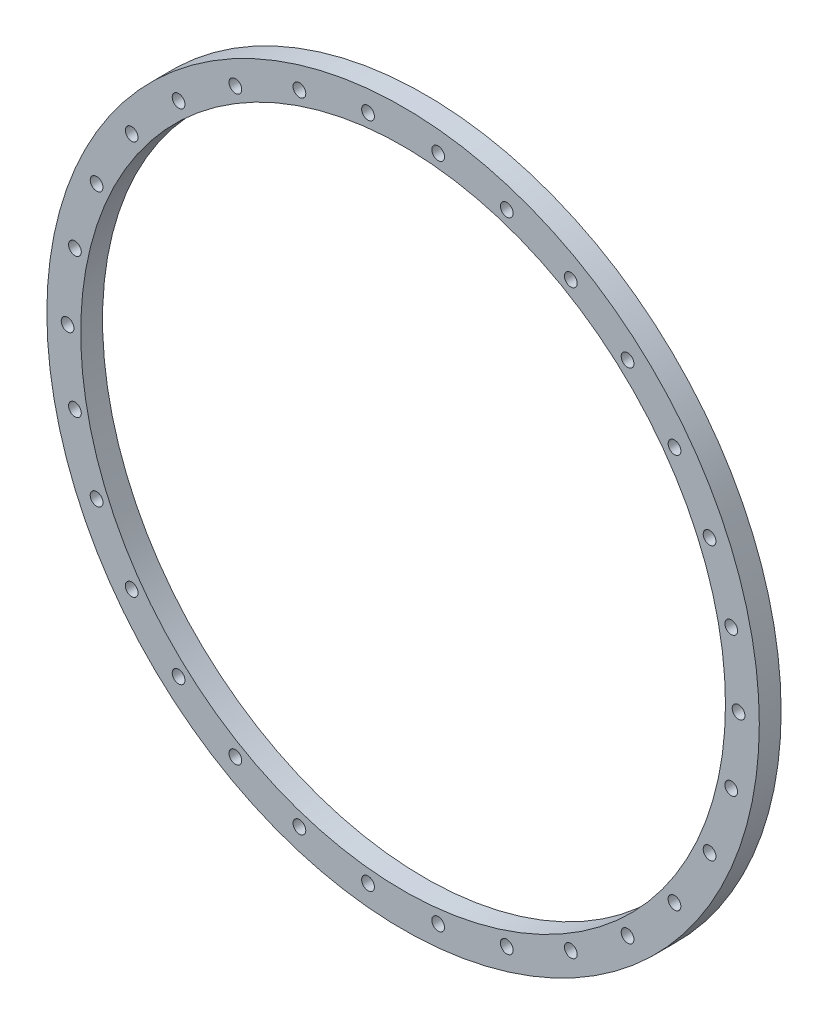
ISO-10303-21;
HEADER;
FILE_DESCRIPTION(('STEP AP214'),'2;1');
FILE_NAME('part.step','',(''),(''),'','','');
FILE_SCHEMA(('AUTOMOTIVE_DESIGN { 1 0 10303 214 1 1 1 1 }'));
ENDSEC;
DATA;
#1=APPLICATION_CONTEXT('core data for automotive mechanical design processes');
#2=APPLICATION_PROTOCOL_DEFINITION('international standard','automotive_design',2000,#1);
#3=PRODUCT_CONTEXT('',#1,'mechanical');
#4=PRODUCT('Part','Part','',(#3));
#5=PRODUCT_RELATED_PRODUCT_CATEGORY('part','',(#4));
#6=PRODUCT_DEFINITION_FORMATION('','',#4);
#7=PRODUCT_DEFINITION_CONTEXT('part definition',#1,'design');
#8=PRODUCT_DEFINITION('design','',#6,#7);
#9=PRODUCT_DEFINITION_SHAPE('','',#8);
#10=(LENGTH_UNIT() NAMED_UNIT(*) SI_UNIT(.MILLI.,.METRE.));
#11=(NAMED_UNIT(*) PLANE_ANGLE_UNIT() SI_UNIT($,.RADIAN.));
#12=(NAMED_UNIT(*) SI_UNIT($,.STERADIAN.) SOLID_ANGLE_UNIT());
#13=UNCERTAINTY_MEASURE_WITH_UNIT(LENGTH_MEASURE(1.E-05),#10,'distance_accuracy_value','');
#14=(GEOMETRIC_REPRESENTATION_CONTEXT(3) GLOBAL_UNCERTAINTY_ASSIGNED_CONTEXT((#13)) GLOBAL_UNIT_ASSIGNED_CONTEXT((#10,
#11,#12)) REPRESENTATION_CONTEXT('',''));
#15=CARTESIAN_POINT('',(0.,0.,0.));
#16=DIRECTION('',(0.,0.,1.));
#17=DIRECTION('',(1.,0.,0.));
#18=AXIS2_PLACEMENT_3D('',#15,#16,#17);
#19=CARTESIAN_POINT('',(0.,0.,30.));
#20=DIRECTION('',(0.,0.,1.));
#21=DIRECTION('',(1.,0.,0.));
#22=AXIS2_PLACEMENT_3D('',#19,#20,#21);
#23=PLANE('',#22);
#24=CARTESIAN_POINT('',(-421.144455973239,-187.505592457944,30.));
#25=DIRECTION('',(0.,0.,1.));
#26=DIRECTION('',(1.,0.,0.));
#27=AXIS2_PLACEMENT_3D('',#24,#25,#26);
#28=CIRCLE('',#27,8.75000000000002);
#29=CARTESIAN_POINT('',(-412.394455973239,-187.505592457944,30.));
#30=VERTEX_POINT('',#29);
#31=EDGE_CURVE('E215',#30,#30,#28,.T.);
#32=ORIENTED_EDGE('',*,*,#31,.F.);
#33=EDGE_LOOP('',(#32));
#34=FACE_BOUND('',#33,.T.);
#35=CARTESIAN_POINT('',(-308.469209531433,-342.589764545079,30.));
#36=DIRECTION('',(0.,0.,1.));
#37=DIRECTION('',(1.,0.,0.));
#38=AXIS2_PLACEMENT_3D('',#35,#36,#37);
#39=CIRCLE('',#38,8.74999999999997);
#40=CARTESIAN_POINT('',(-299.719209531433,-342.589764545079,30.));
#41=VERTEX_POINT('',#40);
#42=EDGE_CURVE('E203',#41,#41,#39,.T.);
#43=ORIENTED_EDGE('',*,*,#42,.F.);
#44=EDGE_LOOP('',(#43));
#45=FACE_BOUND('',#44,.T.);
#46=CARTESIAN_POINT('',(-142.456834406851,-438.437054012066,30.));
#47=DIRECTION('',(0.,0.,1.));
#48=DIRECTION('',(1.,0.,0.));
#49=AXIS2_PLACEMENT_3D('',#46,#47,#48);
#50=CIRCLE('',#49,8.7499999999999);
#51=CARTESIAN_POINT('',(-133.706834406851,-438.437054012066,30.));
#52=VERTEX_POINT('',#51);
#53=EDGE_CURVE('E191',#52,#52,#50,.T.);
#54=ORIENTED_EDGE('',*,*,#53,.F.);
#55=EDGE_LOOP('',(#54));
#56=FACE_BOUND('',#55,.T.);
#57=CARTESIAN_POINT('',(48.1876215663887,-458.474593764774,30.));
#58=DIRECTION('',(0.,0.,1.));
#59=DIRECTION('',(1.,0.,0.));
#60=AXIS2_PLACEMENT_3D('',#57,#58,#59);
#61=CIRCLE('',#60,8.74999999999999);
#62=CARTESIAN_POINT('',(56.9376215663886,-458.474593764774,30.));
#63=VERTEX_POINT('',#62);
#64=EDGE_CURVE('E179',#63,#63,#61,.T.);
#65=ORIENTED_EDGE('',*,*,#64,.F.);
#66=EDGE_LOOP('',(#65));
#67=FACE_BOUND('',#66,.T.);
#68=CARTESIAN_POINT('',(230.5,-399.237711144626,30.));
#69=DIRECTION('',(0.,0.,1.));
#70=DIRECTION('',(1.,0.,0.));
#71=AXIS2_PLACEMENT_3D('',#68,#69,#70);
#72=CIRCLE('',#71,8.7499999999999);
#73=CARTESIAN_POINT('',(239.25,-399.237711144626,30.));
#74=VERTEX_POINT('',#73);
#75=EDGE_CURVE('E167',#74,#74,#72,.T.);
#76=ORIENTED_EDGE('',*,*,#75,.F.);
#77=EDGE_LOOP('',(#76));
#78=FACE_BOUND('',#77,.T.);
#79=CARTESIAN_POINT('',(372.956834406851,-270.96900130683,30.));
#80=DIRECTION('',(0.,0.,1.));
#81=DIRECTION('',(1.,0.,0.));
#82=AXIS2_PLACEMENT_3D('',#79,#80,#81);
#83=CIRCLE('',#82,8.74999999999997);
#84=CARTESIAN_POINT('',(381.706834406851,-270.96900130683,30.));
#85=VERTEX_POINT('',#84);
#86=EDGE_CURVE('E155',#85,#85,#83,.T.);
#87=ORIENTED_EDGE('',*,*,#86,.F.);
#88=EDGE_LOOP('',(#87));
#89=FACE_BOUND('',#88,.T.);
#90=CARTESIAN_POINT('',(450.926043938284,-95.8472894669869,30.));
#91=DIRECTION('',(0.,0.,1.));
#92=DIRECTION('',(1.,0.,0.));
#93=AXIS2_PLACEMENT_3D('',#90,#91,#92);
#94=CIRCLE('',#93,8.74999999999997);
#95=CARTESIAN_POINT('',(459.676043938284,-95.8472894669869,30.));
#96=VERTEX_POINT('',#95);
#97=EDGE_CURVE('E143',#96,#96,#94,.T.);
#98=ORIENTED_EDGE('',*,*,#97,.F.);
#99=EDGE_LOOP('',(#98));
#100=FACE_BOUND('',#99,.T.);
#101=CARTESIAN_POINT('',(450.926043938284,95.8472894669873,30.));
#102=DIRECTION('',(0.,0.,1.));
#103=DIRECTION('',(1.,0.,0.));
#104=AXIS2_PLACEMENT_3D('',#101,#102,#103);
#105=CIRCLE('',#104,8.74999999999991);
#106=CARTESIAN_POINT('',(459.676043938284,95.8472894669873,30.));
#107=VERTEX_POINT('',#106);
#108=EDGE_CURVE('E131',#107,#107,#105,.T.);
#109=ORIENTED_EDGE('',*,*,#108,.F.);
#110=EDGE_LOOP('',(#109));
#111=FACE_BOUND('',#110,.T.);
#112=CARTESIAN_POINT('',(372.956834406851,270.96900130683,30.));
#113=DIRECTION('',(0.,0.,1.));
#114=DIRECTION('',(1.,0.,0.));
#115=AXIS2_PLACEMENT_3D('',#112,#113,#114);
#116=CIRCLE('',#115,8.74999999999997);
#117=CARTESIAN_POINT('',(381.706834406851,270.96900130683,30.));
#118=VERTEX_POINT('',#117);
#119=EDGE_CURVE('E119',#118,#118,#116,.T.);
#120=ORIENTED_EDGE('',*,*,#119,.F.);
#121=EDGE_LOOP('',(#120));
#122=FACE_BOUND('',#121,.T.);
#123=CARTESIAN_POINT('',(230.5,399.237711144626,30.));
#124=DIRECTION('',(0.,0.,1.));
#125=DIRECTION('',(1.,0.,0.));
#126=AXIS2_PLACEMENT_3D('',#123,#124,#125);
#127=CIRCLE('',#126,8.74999999999997);
#128=CARTESIAN_POINT('',(239.25,399.237711144626,30.));
#129=VERTEX_POINT('',#128);
#130=EDGE_CURVE('E107',#129,#129,#127,.T.);
#131=ORIENTED_EDGE('',*,*,#130,.F.);
#132=EDGE_LOOP('',(#131));
#133=FACE_BOUND('',#132,.T.);
#134=CARTESIAN_POINT('',(48.1876215663881,458.474593764774,30.));
#135=DIRECTION('',(0.,0.,1.));
#136=DIRECTION('',(1.,0.,0.));
#137=AXIS2_PLACEMENT_3D('',#134,#135,#136);
#138=CIRCLE('',#137,8.74999999999998);
#139=CARTESIAN_POINT('',(56.9376215663881,458.474593764774,30.));
#140=VERTEX_POINT('',#139);
#141=EDGE_CURVE('E95',#140,#140,#138,.T.);
#142=ORIENTED_EDGE('',*,*,#141,.F.);
#143=EDGE_LOOP('',(#142));
#144=FACE_BOUND('',#143,.T.);
#145=CARTESIAN_POINT('',(-142.456834406851,438.437054012066,30.));
#146=DIRECTION('',(0.,0.,1.));
#147=DIRECTION('',(1.,0.,0.));
#148=AXIS2_PLACEMENT_3D('',#145,#146,#147);
#149=CIRCLE('',#148,8.74999999999997);
#150=CARTESIAN_POINT('',(-133.706834406851,438.437054012066,30.));
#151=VERTEX_POINT('',#150);
#152=EDGE_CURVE('E83',#151,#151,#149,.T.);
#153=ORIENTED_EDGE('',*,*,#152,.F.);
#154=EDGE_LOOP('',(#153));
#155=FACE_BOUND('',#154,.T.);
#156=CARTESIAN_POINT('',(-308.469209531434,342.589764545079,30.));
#157=DIRECTION('',(0.,0.,1.));
#158=DIRECTION('',(1.,0.,0.));
#159=AXIS2_PLACEMENT_3D('',#156,#157,#158);
#160=CIRCLE('',#159,8.74999999999997);
#161=CARTESIAN_POINT('',(-299.719209531434,342.589764545079,30.));
#162=VERTEX_POINT('',#161);
#163=EDGE_CURVE('E71',#162,#162,#160,.T.);
#164=ORIENTED_EDGE('',*,*,#163,.F.);
#165=EDGE_LOOP('',(#164));
#166=FACE_BOUND('',#165,.T.);
#167=CARTESIAN_POINT('',(-421.144455973239,187.505592457944,30.));
#168=DIRECTION('',(0.,0.,1.));
#169=DIRECTION('',(1.,0.,0.));
#170=AXIS2_PLACEMENT_3D('',#167,#168,#169);
#171=CIRCLE('',#170,8.74999999999991);
#172=CARTESIAN_POINT('',(-412.394455973239,187.505592457944,30.));
#173=VERTEX_POINT('',#172);
#174=EDGE_CURVE('E59',#173,#173,#171,.T.);
#175=ORIENTED_EDGE('',*,*,#174,.F.);
#176=EDGE_LOOP('',(#175));
#177=FACE_BOUND('',#176,.T.);
#178=CARTESIAN_POINT('',(-461.,0.,30.));
#179=DIRECTION('',(0.,0.,1.));
#180=DIRECTION('',(1.,0.,0.));
#181=AXIS2_PLACEMENT_3D('',#178,#179,#180);
#182=CIRCLE('',#181,8.74999999999997);
#183=CARTESIAN_POINT('',(-452.25,0.,30.));
#184=VERTEX_POINT('',#183);
#185=EDGE_CURVE('E47',#184,#184,#182,.T.);
#186=ORIENTED_EDGE('',*,*,#185,.F.);
#187=EDGE_LOOP('',(#186));
#188=FACE_BOUND('',#187,.T.);
#189=CARTESIAN_POINT('',(0.,0.,30.));
#190=DIRECTION('',(0.,0.,1.));
#191=DIRECTION('',(1.,0.,0.));
#192=AXIS2_PLACEMENT_3D('',#189,#190,#191);
#193=CIRCLE('',#192,489.5);
#194=CARTESIAN_POINT('',(489.5,0.,30.));
#195=VERTEX_POINT('',#194);
#196=EDGE_CURVE('E10',#195,#195,#193,.T.);
#197=ORIENTED_EDGE('',*,*,#196,.T.);
#198=EDGE_LOOP('',(#197));
#199=FACE_BOUND('',#198,.T.);
#200=CARTESIAN_POINT('',(0.,0.,30.));
#201=DIRECTION('',(0.,0.,1.));
#202=DIRECTION('',(1.,0.,0.));
#203=AXIS2_PLACEMENT_3D('',#200,#201,#202);
#204=CIRCLE('',#203,443.);
#205=CARTESIAN_POINT('',(443.,0.,30.));
#206=VERTEX_POINT('',#205);
#207=EDGE_CURVE('E42',#206,#206,#204,.T.);
#208=ORIENTED_EDGE('',*,*,#207,.F.);
#209=EDGE_LOOP('',(#208));
#210=FACE_BOUND('',#209,.T.);
#211=CARTESIAN_POINT('',(-450.926043938284,95.8472894669871,30.));
#212=DIRECTION('',(0.,0.,1.));
#213=DIRECTION('',(1.,0.,0.));
#214=AXIS2_PLACEMENT_3D('',#211,#212,#213);
#215=CIRCLE('',#214,8.74999999999997);
#216=CARTESIAN_POINT('',(-442.176043938284,95.8472894669871,30.));
#217=VERTEX_POINT('',#216);
#218=EDGE_CURVE('E53',#217,#217,#215,.T.);
#219=ORIENTED_EDGE('',*,*,#218,.F.);
#220=EDGE_LOOP('',(#219));
#221=FACE_BOUND('',#220,.T.);
#222=CARTESIAN_POINT('',(-372.956834406851,270.96900130683,30.));
#223=DIRECTION('',(0.,0.,1.));
#224=DIRECTION('',(1.,0.,0.));
#225=AXIS2_PLACEMENT_3D('',#222,#223,#224);
#226=CIRCLE('',#225,8.75000000000008);
#227=CARTESIAN_POINT('',(-364.206834406851,270.96900130683,30.));
#228=VERTEX_POINT('',#227);
#229=EDGE_CURVE('E65',#228,#228,#226,.T.);
#230=ORIENTED_EDGE('',*,*,#229,.F.);
#231=EDGE_LOOP('',(#230));
#232=FACE_BOUND('',#231,.T.);
#233=CARTESIAN_POINT('',(-230.5,399.237711144626,30.));
#234=DIRECTION('',(0.,0.,1.));
#235=DIRECTION('',(1.,0.,0.));
#236=AXIS2_PLACEMENT_3D('',#233,#234,#235);
#237=CIRCLE('',#236,8.74999999999994);
#238=CARTESIAN_POINT('',(-221.75,399.237711144626,30.));
#239=VERTEX_POINT('',#238);
#240=EDGE_CURVE('E77',#239,#239,#237,.T.);
#241=ORIENTED_EDGE('',*,*,#240,.F.);
#242=EDGE_LOOP('',(#241));
#243=FACE_BOUND('',#242,.T.);
#244=CARTESIAN_POINT('',(-48.1876215663884,458.474593764774,30.));
#245=DIRECTION('',(0.,0.,1.));
#246=DIRECTION('',(1.,0.,0.));
#247=AXIS2_PLACEMENT_3D('',#244,#245,#246);
#248=CIRCLE('',#247,8.75000000000001);
#249=CARTESIAN_POINT('',(-39.4376215663884,458.474593764774,30.));
#250=VERTEX_POINT('',#249);
#251=EDGE_CURVE('E89',#250,#250,#248,.T.);
#252=ORIENTED_EDGE('',*,*,#251,.F.);
#253=EDGE_LOOP('',(#252));
#254=FACE_BOUND('',#253,.T.);
#255=CARTESIAN_POINT('',(142.456834406851,438.437054012066,30.));
#256=DIRECTION('',(0.,0.,1.));
#257=DIRECTION('',(1.,0.,0.));
#258=AXIS2_PLACEMENT_3D('',#255,#256,#257);
#259=CIRCLE('',#258,8.74999999999994);
#260=CARTESIAN_POINT('',(151.206834406851,438.437054012066,30.));
#261=VERTEX_POINT('',#260);
#262=EDGE_CURVE('E101',#261,#261,#259,.T.);
#263=ORIENTED_EDGE('',*,*,#262,.F.);
#264=EDGE_LOOP('',(#263));
#265=FACE_BOUND('',#264,.T.);
#266=CARTESIAN_POINT('',(308.469209531433,342.589764545079,30.));
#267=DIRECTION('',(0.,0.,1.));
#268=DIRECTION('',(1.,0.,0.));
#269=AXIS2_PLACEMENT_3D('',#266,#267,#268);
#270=CIRCLE('',#269,8.74999999999997);
#271=CARTESIAN_POINT('',(317.219209531433,342.589764545079,30.));
#272=VERTEX_POINT('',#271);
#273=EDGE_CURVE('E113',#272,#272,#270,.T.);
#274=ORIENTED_EDGE('',*,*,#273,.F.);
#275=EDGE_LOOP('',(#274));
#276=FACE_BOUND('',#275,.T.);
#277=CARTESIAN_POINT('',(421.144455973239,187.505592457944,30.));
#278=DIRECTION('',(0.,0.,1.));
#279=DIRECTION('',(1.,0.,0.));
#280=AXIS2_PLACEMENT_3D('',#277,#278,#279);
#281=CIRCLE('',#280,8.74999999999997);
#282=CARTESIAN_POINT('',(429.894455973239,187.505592457944,30.));
#283=VERTEX_POINT('',#282);
#284=EDGE_CURVE('E125',#283,#283,#281,.T.);
#285=ORIENTED_EDGE('',*,*,#284,.F.);
#286=EDGE_LOOP('',(#285));
#287=FACE_BOUND('',#286,.T.);
#288=CARTESIAN_POINT('',(461.,1.12912880000787E-13,30.));
#289=DIRECTION('',(0.,0.,1.));
#290=DIRECTION('',(1.,0.,0.));
#291=AXIS2_PLACEMENT_3D('',#288,#289,#290);
#292=CIRCLE('',#291,8.74999999999991);
#293=CARTESIAN_POINT('',(469.75,1.12912880000787E-13,30.));
#294=VERTEX_POINT('',#293);
#295=EDGE_CURVE('E137',#294,#294,#292,.T.);
#296=ORIENTED_EDGE('',*,*,#295,.F.);
#297=EDGE_LOOP('',(#296));
#298=FACE_BOUND('',#297,.T.);
#299=CARTESIAN_POINT('',(421.144455973239,-187.505592457944,30.));
#300=DIRECTION('',(0.,0.,1.));
#301=DIRECTION('',(1.,0.,0.));
#302=AXIS2_PLACEMENT_3D('',#299,#300,#301);
#303=CIRCLE('',#302,8.74999999999997);
#304=CARTESIAN_POINT('',(429.894455973239,-187.505592457944,30.));
#305=VERTEX_POINT('',#304);
#306=EDGE_CURVE('E149',#305,#305,#303,.T.);
#307=ORIENTED_EDGE('',*,*,#306,.F.);
#308=EDGE_LOOP('',(#307));
#309=FACE_BOUND('',#308,.T.);
#310=CARTESIAN_POINT('',(308.469209531434,-342.589764545079,30.));
#311=DIRECTION('',(0.,0.,1.));
#312=DIRECTION('',(1.,0.,0.));
#313=AXIS2_PLACEMENT_3D('',#310,#311,#312);
#314=CIRCLE('',#313,8.75000000000002);
#315=CARTESIAN_POINT('',(317.219209531434,-342.589764545079,30.));
#316=VERTEX_POINT('',#315);
#317=EDGE_CURVE('E161',#316,#316,#314,.T.);
#318=ORIENTED_EDGE('',*,*,#317,.F.);
#319=EDGE_LOOP('',(#318));
#320=FACE_BOUND('',#319,.T.);
#321=CARTESIAN_POINT('',(142.456834406851,-438.437054012066,30.));
#322=DIRECTION('',(0.,0.,1.));
#323=DIRECTION('',(1.,0.,0.));
#324=AXIS2_PLACEMENT_3D('',#321,#322,#323);
#325=CIRCLE('',#324,8.75);
#326=CARTESIAN_POINT('',(151.206834406851,-438.437054012066,30.));
#327=VERTEX_POINT('',#326);
#328=EDGE_CURVE('E173',#327,#327,#325,.T.);
#329=ORIENTED_EDGE('',*,*,#328,.F.);
#330=EDGE_LOOP('',(#329));
#331=FACE_BOUND('',#330,.T.);
#332=CARTESIAN_POINT('',(-48.187621566388,-458.474593764774,30.));
#333=DIRECTION('',(0.,0.,1.));
#334=DIRECTION('',(1.,0.,0.));
#335=AXIS2_PLACEMENT_3D('',#332,#333,#334);
#336=CIRCLE('',#335,8.74999999999997);
#337=CARTESIAN_POINT('',(-39.437621566388,-458.474593764774,30.));
#338=VERTEX_POINT('',#337);
#339=EDGE_CURVE('E185',#338,#338,#336,.T.);
#340=ORIENTED_EDGE('',*,*,#339,.F.);
#341=EDGE_LOOP('',(#340));
#342=FACE_BOUND('',#341,.T.);
#343=CARTESIAN_POINT('',(-230.5,-399.237711144626,30.));
#344=DIRECTION('',(0.,0.,1.));
#345=DIRECTION('',(1.,0.,0.));
#346=AXIS2_PLACEMENT_3D('',#343,#344,#345);
#347=CIRCLE('',#346,8.74999999999997);
#348=CARTESIAN_POINT('',(-221.75,-399.237711144626,30.));
#349=VERTEX_POINT('',#348);
#350=EDGE_CURVE('E197',#349,#349,#347,.T.);
#351=ORIENTED_EDGE('',*,*,#350,.F.);
#352=EDGE_LOOP('',(#351));
#353=FACE_BOUND('',#352,.T.);
#354=CARTESIAN_POINT('',(-372.956834406851,-270.96900130683,30.));
#355=DIRECTION('',(0.,0.,1.));
#356=DIRECTION('',(1.,0.,0.));
#357=AXIS2_PLACEMENT_3D('',#354,#355,#356);
#358=CIRCLE('',#357,8.74999999999997);
#359=CARTESIAN_POINT('',(-364.206834406851,-270.96900130683,30.));
#360=VERTEX_POINT('',#359);
#361=EDGE_CURVE('E209',#360,#360,#358,.T.);
#362=ORIENTED_EDGE('',*,*,#361,.F.);
#363=EDGE_LOOP('',(#362));
#364=FACE_BOUND('',#363,.T.);
#365=CARTESIAN_POINT('',(-450.926043938284,-95.8472894669873,30.));
#366=DIRECTION('',(0.,0.,1.));
#367=DIRECTION('',(1.,0.,0.));
#368=AXIS2_PLACEMENT_3D('',#365,#366,#367);
#369=CIRCLE('',#368,8.74999999999997);
#370=CARTESIAN_POINT('',(-442.176043938284,-95.8472894669873,30.));
#371=VERTEX_POINT('',#370);
#372=EDGE_CURVE('E221',#371,#371,#369,.T.);
#373=ORIENTED_EDGE('',*,*,#372,.F.);
#374=EDGE_LOOP('',(#373));
#375=FACE_BOUND('',#374,.T.);
#376=ADVANCED_FACE('F31',(#34,#45,#56,#67,#78,#89,#100,#111,#122,#133,#144,#155,#166,#177,#188,
#199,#210,#221,#232,#243,#254,#265,#276,#287,#298,#309,#320,#331,#342,#353,#364,#375),#23,.T.);
#377=CARTESIAN_POINT('',(0.,0.,0.));
#378=DIRECTION('',(0.,0.,1.));
#379=DIRECTION('',(1.,0.,0.));
#380=AXIS2_PLACEMENT_3D('',#377,#378,#379);
#381=PLANE('',#380);
#382=CARTESIAN_POINT('',(-421.144455973239,-187.505592457944,0.));
#383=DIRECTION('',(0.,0.,1.));
#384=DIRECTION('',(1.,0.,0.));
#385=AXIS2_PLACEMENT_3D('',#382,#383,#384);
#386=CIRCLE('',#385,8.75000000000002);
#387=CARTESIAN_POINT('',(-412.394455973239,-187.505592457944,0.));
#388=VERTEX_POINT('',#387);
#389=EDGE_CURVE('E218',#388,#388,#386,.T.);
#390=ORIENTED_EDGE('',*,*,#389,.T.);
#391=EDGE_LOOP('',(#390));
#392=FACE_BOUND('',#391,.T.);
#393=CARTESIAN_POINT('',(-308.469209531433,-342.589764545079,0.));
#394=DIRECTION('',(0.,0.,1.));
#395=DIRECTION('',(1.,0.,0.));
#396=AXIS2_PLACEMENT_3D('',#393,#394,#395);
#397=CIRCLE('',#396,8.74999999999997);
#398=CARTESIAN_POINT('',(-299.719209531433,-342.589764545079,0.));
#399=VERTEX_POINT('',#398);
#400=EDGE_CURVE('E206',#399,#399,#397,.T.);
#401=ORIENTED_EDGE('',*,*,#400,.T.);
#402=EDGE_LOOP('',(#401));
#403=FACE_BOUND('',#402,.T.);
#404=CARTESIAN_POINT('',(-142.456834406851,-438.437054012066,0.));
#405=DIRECTION('',(0.,0.,1.));
#406=DIRECTION('',(1.,0.,0.));
#407=AXIS2_PLACEMENT_3D('',#404,#405,#406);
#408=CIRCLE('',#407,8.7499999999999);
#409=CARTESIAN_POINT('',(-133.706834406851,-438.437054012066,0.));
#410=VERTEX_POINT('',#409);
#411=EDGE_CURVE('E194',#410,#410,#408,.T.);
#412=ORIENTED_EDGE('',*,*,#411,.T.);
#413=EDGE_LOOP('',(#412));
#414=FACE_BOUND('',#413,.T.);
#415=CARTESIAN_POINT('',(48.1876215663887,-458.474593764774,0.));
#416=DIRECTION('',(0.,0.,1.));
#417=DIRECTION('',(1.,0.,0.));
#418=AXIS2_PLACEMENT_3D('',#415,#416,#417);
#419=CIRCLE('',#418,8.74999999999999);
#420=CARTESIAN_POINT('',(56.9376215663886,-458.474593764774,0.));
#421=VERTEX_POINT('',#420);
#422=EDGE_CURVE('E182',#421,#421,#419,.T.);
#423=ORIENTED_EDGE('',*,*,#422,.T.);
#424=EDGE_LOOP('',(#423));
#425=FACE_BOUND('',#424,.T.);
#426=CARTESIAN_POINT('',(230.5,-399.237711144626,0.));
#427=DIRECTION('',(0.,0.,1.));
#428=DIRECTION('',(1.,0.,0.));
#429=AXIS2_PLACEMENT_3D('',#426,#427,#428);
#430=CIRCLE('',#429,8.7499999999999);
#431=CARTESIAN_POINT('',(239.25,-399.237711144626,0.));
#432=VERTEX_POINT('',#431);
#433=EDGE_CURVE('E170',#432,#432,#430,.T.);
#434=ORIENTED_EDGE('',*,*,#433,.T.);
#435=EDGE_LOOP('',(#434));
#436=FACE_BOUND('',#435,.T.);
#437=CARTESIAN_POINT('',(372.956834406851,-270.96900130683,0.));
#438=DIRECTION('',(0.,0.,1.));
#439=DIRECTION('',(1.,0.,0.));
#440=AXIS2_PLACEMENT_3D('',#437,#438,#439);
#441=CIRCLE('',#440,8.74999999999997);
#442=CARTESIAN_POINT('',(381.706834406851,-270.96900130683,0.));
#443=VERTEX_POINT('',#442);
#444=EDGE_CURVE('E158',#443,#443,#441,.T.);
#445=ORIENTED_EDGE('',*,*,#444,.T.);
#446=EDGE_LOOP('',(#445));
#447=FACE_BOUND('',#446,.T.);
#448=CARTESIAN_POINT('',(450.926043938284,-95.8472894669869,0.));
#449=DIRECTION('',(0.,0.,1.));
#450=DIRECTION('',(1.,0.,0.));
#451=AXIS2_PLACEMENT_3D('',#448,#449,#450);
#452=CIRCLE('',#451,8.74999999999997);
#453=CARTESIAN_POINT('',(459.676043938284,-95.8472894669869,0.));
#454=VERTEX_POINT('',#453);
#455=EDGE_CURVE('E146',#454,#454,#452,.T.);
#456=ORIENTED_EDGE('',*,*,#455,.T.);
#457=EDGE_LOOP('',(#456));
#458=FACE_BOUND('',#457,.T.);
#459=CARTESIAN_POINT('',(450.926043938284,95.8472894669873,0.));
#460=DIRECTION('',(0.,0.,1.));
#461=DIRECTION('',(1.,0.,0.));
#462=AXIS2_PLACEMENT_3D('',#459,#460,#461);
#463=CIRCLE('',#462,8.74999999999991);
#464=CARTESIAN_POINT('',(459.676043938284,95.8472894669873,0.));
#465=VERTEX_POINT('',#464);
#466=EDGE_CURVE('E134',#465,#465,#463,.T.);
#467=ORIENTED_EDGE('',*,*,#466,.T.);
#468=EDGE_LOOP('',(#467));
#469=FACE_BOUND('',#468,.T.);
#470=CARTESIAN_POINT('',(372.956834406851,270.96900130683,0.));
#471=DIRECTION('',(0.,0.,1.));
#472=DIRECTION('',(1.,0.,0.));
#473=AXIS2_PLACEMENT_3D('',#470,#471,#472);
#474=CIRCLE('',#473,8.74999999999997);
#475=CARTESIAN_POINT('',(381.706834406851,270.96900130683,0.));
#476=VERTEX_POINT('',#475);
#477=EDGE_CURVE('E122',#476,#476,#474,.T.);
#478=ORIENTED_EDGE('',*,*,#477,.T.);
#479=EDGE_LOOP('',(#478));
#480=FACE_BOUND('',#479,.T.);
#481=CARTESIAN_POINT('',(230.5,399.237711144626,0.));
#482=DIRECTION('',(0.,0.,1.));
#483=DIRECTION('',(1.,0.,0.));
#484=AXIS2_PLACEMENT_3D('',#481,#482,#483);
#485=CIRCLE('',#484,8.74999999999997);
#486=CARTESIAN_POINT('',(239.25,399.237711144626,0.));
#487=VERTEX_POINT('',#486);
#488=EDGE_CURVE('E110',#487,#487,#485,.T.);
#489=ORIENTED_EDGE('',*,*,#488,.T.);
#490=EDGE_LOOP('',(#489));
#491=FACE_BOUND('',#490,.T.);
#492=CARTESIAN_POINT('',(48.1876215663881,458.474593764774,0.));
#493=DIRECTION('',(0.,0.,1.));
#494=DIRECTION('',(1.,0.,0.));
#495=AXIS2_PLACEMENT_3D('',#492,#493,#494);
#496=CIRCLE('',#495,8.74999999999998);
#497=CARTESIAN_POINT('',(56.9376215663881,458.474593764774,0.));
#498=VERTEX_POINT('',#497);
#499=EDGE_CURVE('E98',#498,#498,#496,.T.);
#500=ORIENTED_EDGE('',*,*,#499,.T.);
#501=EDGE_LOOP('',(#500));
#502=FACE_BOUND('',#501,.T.);
#503=CARTESIAN_POINT('',(-142.456834406851,438.437054012066,0.));
#504=DIRECTION('',(0.,0.,1.));
#505=DIRECTION('',(1.,0.,0.));
#506=AXIS2_PLACEMENT_3D('',#503,#504,#505);
#507=CIRCLE('',#506,8.74999999999997);
#508=CARTESIAN_POINT('',(-133.706834406851,438.437054012066,0.));
#509=VERTEX_POINT('',#508);
#510=EDGE_CURVE('E86',#509,#509,#507,.T.);
#511=ORIENTED_EDGE('',*,*,#510,.T.);
#512=EDGE_LOOP('',(#511));
#513=FACE_BOUND('',#512,.T.);
#514=CARTESIAN_POINT('',(-308.469209531434,342.589764545079,0.));
#515=DIRECTION('',(0.,0.,1.));
#516=DIRECTION('',(1.,0.,0.));
#517=AXIS2_PLACEMENT_3D('',#514,#515,#516);
#518=CIRCLE('',#517,8.74999999999997);
#519=CARTESIAN_POINT('',(-299.719209531434,342.589764545079,0.));
#520=VERTEX_POINT('',#519);
#521=EDGE_CURVE('E74',#520,#520,#518,.T.);
#522=ORIENTED_EDGE('',*,*,#521,.T.);
#523=EDGE_LOOP('',(#522));
#524=FACE_BOUND('',#523,.T.);
#525=CARTESIAN_POINT('',(-421.144455973239,187.505592457944,0.));
#526=DIRECTION('',(0.,0.,1.));
#527=DIRECTION('',(1.,0.,0.));
#528=AXIS2_PLACEMENT_3D('',#525,#526,#527);
#529=CIRCLE('',#528,8.74999999999991);
#530=CARTESIAN_POINT('',(-412.394455973239,187.505592457944,0.));
#531=VERTEX_POINT('',#530);
#532=EDGE_CURVE('E62',#531,#531,#529,.T.);
#533=ORIENTED_EDGE('',*,*,#532,.T.);
#534=EDGE_LOOP('',(#533));
#535=FACE_BOUND('',#534,.T.);
#536=CARTESIAN_POINT('',(-461.,0.,0.));
#537=DIRECTION('',(0.,0.,1.));
#538=DIRECTION('',(1.,0.,0.));
#539=AXIS2_PLACEMENT_3D('',#536,#537,#538);
#540=CIRCLE('',#539,8.74999999999997);
#541=CARTESIAN_POINT('',(-452.25,0.,0.));
#542=VERTEX_POINT('',#541);
#543=EDGE_CURVE('E50',#542,#542,#540,.T.);
#544=ORIENTED_EDGE('',*,*,#543,.T.);
#545=EDGE_LOOP('',(#544));
#546=FACE_BOUND('',#545,.T.);
#547=CARTESIAN_POINT('',(0.,0.,0.));
#548=DIRECTION('',(0.,0.,1.));
#549=DIRECTION('',(1.,0.,0.));
#550=AXIS2_PLACEMENT_3D('',#547,#548,#549);
#551=CIRCLE('',#550,489.5);
#552=CARTESIAN_POINT('',(489.5,0.,0.));
#553=VERTEX_POINT('',#552);
#554=EDGE_CURVE('E35',#553,#553,#551,.T.);
#555=ORIENTED_EDGE('',*,*,#554,.F.);
#556=EDGE_LOOP('',(#555));
#557=FACE_BOUND('',#556,.T.);
#558=CARTESIAN_POINT('',(0.,0.,0.));
#559=DIRECTION('',(0.,0.,1.));
#560=DIRECTION('',(1.,0.,0.));
#561=AXIS2_PLACEMENT_3D('',#558,#559,#560);
#562=CIRCLE('',#561,443.);
#563=CARTESIAN_POINT('',(443.,0.,0.));
#564=VERTEX_POINT('',#563);
#565=EDGE_CURVE('E44',#564,#564,#562,.T.);
#566=ORIENTED_EDGE('',*,*,#565,.T.);
#567=EDGE_LOOP('',(#566));
#568=FACE_BOUND('',#567,.T.);
#569=CARTESIAN_POINT('',(-450.926043938284,95.8472894669871,0.));
#570=DIRECTION('',(0.,0.,1.));
#571=DIRECTION('',(1.,0.,0.));
#572=AXIS2_PLACEMENT_3D('',#569,#570,#571);
#573=CIRCLE('',#572,8.74999999999997);
#574=CARTESIAN_POINT('',(-442.176043938284,95.8472894669871,0.));
#575=VERTEX_POINT('',#574);
#576=EDGE_CURVE('E56',#575,#575,#573,.T.);
#577=ORIENTED_EDGE('',*,*,#576,.T.);
#578=EDGE_LOOP('',(#577));
#579=FACE_BOUND('',#578,.T.);
#580=CARTESIAN_POINT('',(-372.956834406851,270.96900130683,0.));
#581=DIRECTION('',(0.,0.,1.));
#582=DIRECTION('',(1.,0.,0.));
#583=AXIS2_PLACEMENT_3D('',#580,#581,#582);
#584=CIRCLE('',#583,8.75000000000008);
#585=CARTESIAN_POINT('',(-364.206834406851,270.96900130683,0.));
#586=VERTEX_POINT('',#585);
#587=EDGE_CURVE('E68',#586,#586,#584,.T.);
#588=ORIENTED_EDGE('',*,*,#587,.T.);
#589=EDGE_LOOP('',(#588));
#590=FACE_BOUND('',#589,.T.);
#591=CARTESIAN_POINT('',(-230.5,399.237711144626,0.));
#592=DIRECTION('',(0.,0.,1.));
#593=DIRECTION('',(1.,0.,0.));
#594=AXIS2_PLACEMENT_3D('',#591,#592,#593);
#595=CIRCLE('',#594,8.74999999999994);
#596=CARTESIAN_POINT('',(-221.75,399.237711144626,0.));
#597=VERTEX_POINT('',#596);
#598=EDGE_CURVE('E80',#597,#597,#595,.T.);
#599=ORIENTED_EDGE('',*,*,#598,.T.);
#600=EDGE_LOOP('',(#599));
#601=FACE_BOUND('',#600,.T.);
#602=CARTESIAN_POINT('',(-48.1876215663884,458.474593764774,0.));
#603=DIRECTION('',(0.,0.,1.));
#604=DIRECTION('',(1.,0.,0.));
#605=AXIS2_PLACEMENT_3D('',#602,#603,#604);
#606=CIRCLE('',#605,8.75000000000001);
#607=CARTESIAN_POINT('',(-39.4376215663884,458.474593764774,0.));
#608=VERTEX_POINT('',#607);
#609=EDGE_CURVE('E92',#608,#608,#606,.T.);
#610=ORIENTED_EDGE('',*,*,#609,.T.);
#611=EDGE_LOOP('',(#610));
#612=FACE_BOUND('',#611,.T.);
#613=CARTESIAN_POINT('',(142.456834406851,438.437054012066,0.));
#614=DIRECTION('',(0.,0.,1.));
#615=DIRECTION('',(1.,0.,0.));
#616=AXIS2_PLACEMENT_3D('',#613,#614,#615);
#617=CIRCLE('',#616,8.74999999999994);
#618=CARTESIAN_POINT('',(151.206834406851,438.437054012066,0.));
#619=VERTEX_POINT('',#618);
#620=EDGE_CURVE('E104',#619,#619,#617,.T.);
#621=ORIENTED_EDGE('',*,*,#620,.T.);
#622=EDGE_LOOP('',(#621));
#623=FACE_BOUND('',#622,.T.);
#624=CARTESIAN_POINT('',(308.469209531433,342.589764545079,0.));
#625=DIRECTION('',(0.,0.,1.));
#626=DIRECTION('',(1.,0.,0.));
#627=AXIS2_PLACEMENT_3D('',#624,#625,#626);
#628=CIRCLE('',#627,8.74999999999997);
#629=CARTESIAN_POINT('',(317.219209531433,342.589764545079,0.));
#630=VERTEX_POINT('',#629);
#631=EDGE_CURVE('E116',#630,#630,#628,.T.);
#632=ORIENTED_EDGE('',*,*,#631,.T.);
#633=EDGE_LOOP('',(#632));
#634=FACE_BOUND('',#633,.T.);
#635=CARTESIAN_POINT('',(421.144455973239,187.505592457944,0.));
#636=DIRECTION('',(0.,0.,1.));
#637=DIRECTION('',(1.,0.,0.));
#638=AXIS2_PLACEMENT_3D('',#635,#636,#637);
#639=CIRCLE('',#638,8.74999999999997);
#640=CARTESIAN_POINT('',(429.894455973239,187.505592457944,0.));
#641=VERTEX_POINT('',#640);
#642=EDGE_CURVE('E128',#641,#641,#639,.T.);
#643=ORIENTED_EDGE('',*,*,#642,.T.);
#644=EDGE_LOOP('',(#643));
#645=FACE_BOUND('',#644,.T.);
#646=CARTESIAN_POINT('',(461.,1.12912880000787E-13,0.));
#647=DIRECTION('',(0.,0.,1.));
#648=DIRECTION('',(1.,0.,0.));
#649=AXIS2_PLACEMENT_3D('',#646,#647,#648);
#650=CIRCLE('',#649,8.74999999999991);
#651=CARTESIAN_POINT('',(469.75,1.12912880000787E-13,0.));
#652=VERTEX_POINT('',#651);
#653=EDGE_CURVE('E140',#652,#652,#650,.T.);
#654=ORIENTED_EDGE('',*,*,#653,.T.);
#655=EDGE_LOOP('',(#654));
#656=FACE_BOUND('',#655,.T.);
#657=CARTESIAN_POINT('',(421.144455973239,-187.505592457944,0.));
#658=DIRECTION('',(0.,0.,1.));
#659=DIRECTION('',(1.,0.,0.));
#660=AXIS2_PLACEMENT_3D('',#657,#658,#659);
#661=CIRCLE('',#660,8.74999999999997);
#662=CARTESIAN_POINT('',(429.894455973239,-187.505592457944,0.));
#663=VERTEX_POINT('',#662);
#664=EDGE_CURVE('E152',#663,#663,#661,.T.);
#665=ORIENTED_EDGE('',*,*,#664,.T.);
#666=EDGE_LOOP('',(#665));
#667=FACE_BOUND('',#666,.T.);
#668=CARTESIAN_POINT('',(308.469209531434,-342.589764545079,0.));
#669=DIRECTION('',(0.,0.,1.));
#670=DIRECTION('',(1.,0.,0.));
#671=AXIS2_PLACEMENT_3D('',#668,#669,#670);
#672=CIRCLE('',#671,8.75000000000002);
#673=CARTESIAN_POINT('',(317.219209531434,-342.589764545079,0.));
#674=VERTEX_POINT('',#673);
#675=EDGE_CURVE('E164',#674,#674,#672,.T.);
#676=ORIENTED_EDGE('',*,*,#675,.T.);
#677=EDGE_LOOP('',(#676));
#678=FACE_BOUND('',#677,.T.);
#679=CARTESIAN_POINT('',(142.456834406851,-438.437054012066,0.));
#680=DIRECTION('',(0.,0.,1.));
#681=DIRECTION('',(1.,0.,0.));
#682=AXIS2_PLACEMENT_3D('',#679,#680,#681);
#683=CIRCLE('',#682,8.75);
#684=CARTESIAN_POINT('',(151.206834406851,-438.437054012066,0.));
#685=VERTEX_POINT('',#684);
#686=EDGE_CURVE('E176',#685,#685,#683,.T.);
#687=ORIENTED_EDGE('',*,*,#686,.T.);
#688=EDGE_LOOP('',(#687));
#689=FACE_BOUND('',#688,.T.);
#690=CARTESIAN_POINT('',(-48.187621566388,-458.474593764774,0.));
#691=DIRECTION('',(0.,0.,1.));
#692=DIRECTION('',(1.,0.,0.));
#693=AXIS2_PLACEMENT_3D('',#690,#691,#692);
#694=CIRCLE('',#693,8.74999999999997);
#695=CARTESIAN_POINT('',(-39.437621566388,-458.474593764774,0.));
#696=VERTEX_POINT('',#695);
#697=EDGE_CURVE('E188',#696,#696,#694,.T.);
#698=ORIENTED_EDGE('',*,*,#697,.T.);
#699=EDGE_LOOP('',(#698));
#700=FACE_BOUND('',#699,.T.);
#701=CARTESIAN_POINT('',(-230.5,-399.237711144626,0.));
#702=DIRECTION('',(0.,0.,1.));
#703=DIRECTION('',(1.,0.,0.));
#704=AXIS2_PLACEMENT_3D('',#701,#702,#703);
#705=CIRCLE('',#704,8.74999999999997);
#706=CARTESIAN_POINT('',(-221.75,-399.237711144626,0.));
#707=VERTEX_POINT('',#706);
#708=EDGE_CURVE('E200',#707,#707,#705,.T.);
#709=ORIENTED_EDGE('',*,*,#708,.T.);
#710=EDGE_LOOP('',(#709));
#711=FACE_BOUND('',#710,.T.);
#712=CARTESIAN_POINT('',(-372.956834406851,-270.96900130683,0.));
#713=DIRECTION('',(0.,0.,1.));
#714=DIRECTION('',(1.,0.,0.));
#715=AXIS2_PLACEMENT_3D('',#712,#713,#714);
#716=CIRCLE('',#715,8.74999999999997);
#717=CARTESIAN_POINT('',(-364.206834406851,-270.96900130683,0.));
#718=VERTEX_POINT('',#717);
#719=EDGE_CURVE('E212',#718,#718,#716,.T.);
#720=ORIENTED_EDGE('',*,*,#719,.T.);
#721=EDGE_LOOP('',(#720));
#722=FACE_BOUND('',#721,.T.);
#723=CARTESIAN_POINT('',(-450.926043938284,-95.8472894669873,0.));
#724=DIRECTION('',(0.,0.,1.));
#725=DIRECTION('',(1.,0.,0.));
#726=AXIS2_PLACEMENT_3D('',#723,#724,#725);
#727=CIRCLE('',#726,8.74999999999997);
#728=CARTESIAN_POINT('',(-442.176043938284,-95.8472894669873,0.));
#729=VERTEX_POINT('',#728);
#730=EDGE_CURVE('E224',#729,#729,#727,.T.);
#731=ORIENTED_EDGE('',*,*,#730,.T.);
#732=EDGE_LOOP('',(#731));
#733=FACE_BOUND('',#732,.T.);
#734=ADVANCED_FACE('F234',(#392,#403,#414,#425,#436,#447,#458,#469,#480,#491,#502,#513,#524,
#535,#546,#557,#568,#579,#590,#601,#612,#623,#634,#645,#656,#667,#678,#689,#700,#711,#722,#733),
#381,.F.);
#735=CARTESIAN_POINT('',(0.,0.,30.));
#736=DIRECTION('',(0.,0.,-1.));
#737=DIRECTION('',(-1.,0.,0.));
#738=AXIS2_PLACEMENT_3D('',#735,#736,#737);
#739=CYLINDRICAL_SURFACE('',#738,489.5);
#740=ORIENTED_EDGE('',*,*,#196,.F.);
#741=EDGE_LOOP('',(#740));
#742=FACE_BOUND('',#741,.T.);
#743=ORIENTED_EDGE('',*,*,#554,.T.);
#744=EDGE_LOOP('',(#743));
#745=FACE_BOUND('',#744,.T.);
#746=ADVANCED_FACE('F33',(#742,#745),#739,.T.);
#747=CARTESIAN_POINT('',(0.,0.,30.));
#748=DIRECTION('',(0.,0.,-1.));
#749=DIRECTION('',(-1.,0.,0.));
#750=AXIS2_PLACEMENT_3D('',#747,#748,#749);
#751=CYLINDRICAL_SURFACE('',#750,443.);
#752=ORIENTED_EDGE('',*,*,#207,.T.);
#753=EDGE_LOOP('',(#752));
#754=FACE_BOUND('',#753,.T.);
#755=ORIENTED_EDGE('',*,*,#565,.F.);
#756=EDGE_LOOP('',(#755));
#757=FACE_BOUND('',#756,.T.);
#758=ADVANCED_FACE('F244',(#754,#757),#751,.F.);
#759=CARTESIAN_POINT('',(-461.,0.,30.));
#760=DIRECTION('',(0.,0.,-1.));
#761=DIRECTION('',(-1.,0.,0.));
#762=AXIS2_PLACEMENT_3D('',#759,#760,#761);
#763=CYLINDRICAL_SURFACE('',#762,8.74999999999997);
#764=ORIENTED_EDGE('',*,*,#185,.T.);
#765=EDGE_LOOP('',(#764));
#766=FACE_BOUND('',#765,.T.);
#767=ORIENTED_EDGE('',*,*,#543,.F.);
#768=EDGE_LOOP('',(#767));
#769=FACE_BOUND('',#768,.T.);
#770=ADVANCED_FACE('F247',(#766,#769),#763,.F.);
#771=CARTESIAN_POINT('',(-450.926043938284,95.8472894669871,30.));
#772=DIRECTION('',(0.,0.,-1.));
#773=DIRECTION('',(-1.,0.,0.));
#774=AXIS2_PLACEMENT_3D('',#771,#772,#773);
#775=CYLINDRICAL_SURFACE('',#774,8.74999999999997);
#776=ORIENTED_EDGE('',*,*,#218,.T.);
#777=EDGE_LOOP('',(#776));
#778=FACE_BOUND('',#777,.T.);
#779=ORIENTED_EDGE('',*,*,#576,.F.);
#780=EDGE_LOOP('',(#779));
#781=FACE_BOUND('',#780,.T.);
#782=ADVANCED_FACE('F251',(#778,#781),#775,.F.);
#783=CARTESIAN_POINT('',(-421.144455973239,187.505592457944,30.));
#784=DIRECTION('',(0.,0.,-1.));
#785=DIRECTION('',(-1.,0.,0.));
#786=AXIS2_PLACEMENT_3D('',#783,#784,#785);
#787=CYLINDRICAL_SURFACE('',#786,8.74999999999991);
#788=ORIENTED_EDGE('',*,*,#174,.T.);
#789=EDGE_LOOP('',(#788));
#790=FACE_BOUND('',#789,.T.);
#791=ORIENTED_EDGE('',*,*,#532,.F.);
#792=EDGE_LOOP('',(#791));
#793=FACE_BOUND('',#792,.T.);
#794=ADVANCED_FACE('F255',(#790,#793),#787,.F.);
#795=CARTESIAN_POINT('',(-372.956834406851,270.96900130683,30.));
#796=DIRECTION('',(0.,0.,-1.));
#797=DIRECTION('',(-1.,0.,0.));
#798=AXIS2_PLACEMENT_3D('',#795,#796,#797);
#799=CYLINDRICAL_SURFACE('',#798,8.75000000000008);
#800=ORIENTED_EDGE('',*,*,#229,.T.);
#801=EDGE_LOOP('',(#800));
#802=FACE_BOUND('',#801,.T.);
#803=ORIENTED_EDGE('',*,*,#587,.F.);
#804=EDGE_LOOP('',(#803));
#805=FACE_BOUND('',#804,.T.);
#806=ADVANCED_FACE('F259',(#802,#805),#799,.F.);
#807=CARTESIAN_POINT('',(-308.469209531434,342.589764545079,30.));
#808=DIRECTION('',(0.,0.,-1.));
#809=DIRECTION('',(-1.,0.,0.));
#810=AXIS2_PLACEMENT_3D('',#807,#808,#809);
#811=CYLINDRICAL_SURFACE('',#810,8.74999999999997);
#812=ORIENTED_EDGE('',*,*,#163,.T.);
#813=EDGE_LOOP('',(#812));
#814=FACE_BOUND('',#813,.T.);
#815=ORIENTED_EDGE('',*,*,#521,.F.);
#816=EDGE_LOOP('',(#815));
#817=FACE_BOUND('',#816,.T.);
#818=ADVANCED_FACE('F263',(#814,#817),#811,.F.);
#819=CARTESIAN_POINT('',(-230.5,399.237711144626,30.));
#820=DIRECTION('',(0.,0.,-1.));
#821=DIRECTION('',(-1.,0.,0.));
#822=AXIS2_PLACEMENT_3D('',#819,#820,#821);
#823=CYLINDRICAL_SURFACE('',#822,8.74999999999994);
#824=ORIENTED_EDGE('',*,*,#240,.T.);
#825=EDGE_LOOP('',(#824));
#826=FACE_BOUND('',#825,.T.);
#827=ORIENTED_EDGE('',*,*,#598,.F.);
#828=EDGE_LOOP('',(#827));
#829=FACE_BOUND('',#828,.T.);
#830=ADVANCED_FACE('F267',(#826,#829),#823,.F.);
#831=CARTESIAN_POINT('',(-142.456834406851,438.437054012066,30.));
#832=DIRECTION('',(0.,0.,-1.));
#833=DIRECTION('',(-1.,0.,0.));
#834=AXIS2_PLACEMENT_3D('',#831,#832,#833);
#835=CYLINDRICAL_SURFACE('',#834,8.74999999999997);
#836=ORIENTED_EDGE('',*,*,#152,.T.);
#837=EDGE_LOOP('',(#836));
#838=FACE_BOUND('',#837,.T.);
#839=ORIENTED_EDGE('',*,*,#510,.F.);
#840=EDGE_LOOP('',(#839));
#841=FACE_BOUND('',#840,.T.);
#842=ADVANCED_FACE('F271',(#838,#841),#835,.F.);
#843=CARTESIAN_POINT('',(-48.1876215663884,458.474593764774,30.));
#844=DIRECTION('',(0.,0.,-1.));
#845=DIRECTION('',(-1.,0.,0.));
#846=AXIS2_PLACEMENT_3D('',#843,#844,#845);
#847=CYLINDRICAL_SURFACE('',#846,8.75000000000001);
#848=ORIENTED_EDGE('',*,*,#251,.T.);
#849=EDGE_LOOP('',(#848));
#850=FACE_BOUND('',#849,.T.);
#851=ORIENTED_EDGE('',*,*,#609,.F.);
#852=EDGE_LOOP('',(#851));
#853=FACE_BOUND('',#852,.T.);
#854=ADVANCED_FACE('F275',(#850,#853),#847,.F.);
#855=CARTESIAN_POINT('',(48.1876215663881,458.474593764774,30.));
#856=DIRECTION('',(0.,0.,-1.));
#857=DIRECTION('',(-1.,0.,0.));
#858=AXIS2_PLACEMENT_3D('',#855,#856,#857);
#859=CYLINDRICAL_SURFACE('',#858,8.74999999999998);
#860=ORIENTED_EDGE('',*,*,#141,.T.);
#861=EDGE_LOOP('',(#860));
#862=FACE_BOUND('',#861,.T.);
#863=ORIENTED_EDGE('',*,*,#499,.F.);
#864=EDGE_LOOP('',(#863));
#865=FACE_BOUND('',#864,.T.);
#866=ADVANCED_FACE('F279',(#862,#865),#859,.F.);
#867=CARTESIAN_POINT('',(142.456834406851,438.437054012066,30.));
#868=DIRECTION('',(0.,0.,-1.));
#869=DIRECTION('',(-1.,0.,0.));
#870=AXIS2_PLACEMENT_3D('',#867,#868,#869);
#871=CYLINDRICAL_SURFACE('',#870,8.74999999999994);
#872=ORIENTED_EDGE('',*,*,#262,.T.);
#873=EDGE_LOOP('',(#872));
#874=FACE_BOUND('',#873,.T.);
#875=ORIENTED_EDGE('',*,*,#620,.F.);
#876=EDGE_LOOP('',(#875));
#877=FACE_BOUND('',#876,.T.);
#878=ADVANCED_FACE('F283',(#874,#877),#871,.F.);
#879=CARTESIAN_POINT('',(230.5,399.237711144626,30.));
#880=DIRECTION('',(0.,0.,-1.));
#881=DIRECTION('',(-1.,0.,0.));
#882=AXIS2_PLACEMENT_3D('',#879,#880,#881);
#883=CYLINDRICAL_SURFACE('',#882,8.74999999999997);
#884=ORIENTED_EDGE('',*,*,#130,.T.);
#885=EDGE_LOOP('',(#884));
#886=FACE_BOUND('',#885,.T.);
#887=ORIENTED_EDGE('',*,*,#488,.F.);
#888=EDGE_LOOP('',(#887));
#889=FACE_BOUND('',#888,.T.);
#890=ADVANCED_FACE('F287',(#886,#889),#883,.F.);
#891=CARTESIAN_POINT('',(308.469209531433,342.589764545079,30.));
#892=DIRECTION('',(0.,0.,-1.));
#893=DIRECTION('',(-1.,0.,0.));
#894=AXIS2_PLACEMENT_3D('',#891,#892,#893);
#895=CYLINDRICAL_SURFACE('',#894,8.74999999999997);
#896=ORIENTED_EDGE('',*,*,#273,.T.);
#897=EDGE_LOOP('',(#896));
#898=FACE_BOUND('',#897,.T.);
#899=ORIENTED_EDGE('',*,*,#631,.F.);
#900=EDGE_LOOP('',(#899));
#901=FACE_BOUND('',#900,.T.);
#902=ADVANCED_FACE('F291',(#898,#901),#895,.F.);
#903=CARTESIAN_POINT('',(372.956834406851,270.96900130683,30.));
#904=DIRECTION('',(0.,0.,-1.));
#905=DIRECTION('',(-1.,0.,0.));
#906=AXIS2_PLACEMENT_3D('',#903,#904,#905);
#907=CYLINDRICAL_SURFACE('',#906,8.74999999999997);
#908=ORIENTED_EDGE('',*,*,#119,.T.);
#909=EDGE_LOOP('',(#908));
#910=FACE_BOUND('',#909,.T.);
#911=ORIENTED_EDGE('',*,*,#477,.F.);
#912=EDGE_LOOP('',(#911));
#913=FACE_BOUND('',#912,.T.);
#914=ADVANCED_FACE('F295',(#910,#913),#907,.F.);
#915=CARTESIAN_POINT('',(421.144455973239,187.505592457944,30.));
#916=DIRECTION('',(0.,0.,-1.));
#917=DIRECTION('',(-1.,0.,0.));
#918=AXIS2_PLACEMENT_3D('',#915,#916,#917);
#919=CYLINDRICAL_SURFACE('',#918,8.74999999999997);
#920=ORIENTED_EDGE('',*,*,#284,.T.);
#921=EDGE_LOOP('',(#920));
#922=FACE_BOUND('',#921,.T.);
#923=ORIENTED_EDGE('',*,*,#642,.F.);
#924=EDGE_LOOP('',(#923));
#925=FACE_BOUND('',#924,.T.);
#926=ADVANCED_FACE('F299',(#922,#925),#919,.F.);
#927=CARTESIAN_POINT('',(450.926043938284,95.8472894669873,30.));
#928=DIRECTION('',(0.,0.,-1.));
#929=DIRECTION('',(-1.,0.,0.));
#930=AXIS2_PLACEMENT_3D('',#927,#928,#929);
#931=CYLINDRICAL_SURFACE('',#930,8.74999999999991);
#932=ORIENTED_EDGE('',*,*,#108,.T.);
#933=EDGE_LOOP('',(#932));
#934=FACE_BOUND('',#933,.T.);
#935=ORIENTED_EDGE('',*,*,#466,.F.);
#936=EDGE_LOOP('',(#935));
#937=FACE_BOUND('',#936,.T.);
#938=ADVANCED_FACE('F303',(#934,#937),#931,.F.);
#939=CARTESIAN_POINT('',(461.,1.12912880000787E-13,30.));
#940=DIRECTION('',(0.,0.,-1.));
#941=DIRECTION('',(-1.,0.,0.));
#942=AXIS2_PLACEMENT_3D('',#939,#940,#941);
#943=CYLINDRICAL_SURFACE('',#942,8.74999999999991);
#944=ORIENTED_EDGE('',*,*,#295,.T.);
#945=EDGE_LOOP('',(#944));
#946=FACE_BOUND('',#945,.T.);
#947=ORIENTED_EDGE('',*,*,#653,.F.);
#948=EDGE_LOOP('',(#947));
#949=FACE_BOUND('',#948,.T.);
#950=ADVANCED_FACE('F307',(#946,#949),#943,.F.);
#951=CARTESIAN_POINT('',(450.926043938284,-95.8472894669869,30.));
#952=DIRECTION('',(0.,0.,-1.));
#953=DIRECTION('',(-1.,0.,0.));
#954=AXIS2_PLACEMENT_3D('',#951,#952,#953);
#955=CYLINDRICAL_SURFACE('',#954,8.74999999999997);
#956=ORIENTED_EDGE('',*,*,#97,.T.);
#957=EDGE_LOOP('',(#956));
#958=FACE_BOUND('',#957,.T.);
#959=ORIENTED_EDGE('',*,*,#455,.F.);
#960=EDGE_LOOP('',(#959));
#961=FACE_BOUND('',#960,.T.);
#962=ADVANCED_FACE('F311',(#958,#961),#955,.F.);
#963=CARTESIAN_POINT('',(421.144455973239,-187.505592457944,30.));
#964=DIRECTION('',(0.,0.,-1.));
#965=DIRECTION('',(-1.,0.,0.));
#966=AXIS2_PLACEMENT_3D('',#963,#964,#965);
#967=CYLINDRICAL_SURFACE('',#966,8.74999999999997);
#968=ORIENTED_EDGE('',*,*,#306,.T.);
#969=EDGE_LOOP('',(#968));
#970=FACE_BOUND('',#969,.T.);
#971=ORIENTED_EDGE('',*,*,#664,.F.);
#972=EDGE_LOOP('',(#971));
#973=FACE_BOUND('',#972,.T.);
#974=ADVANCED_FACE('F315',(#970,#973),#967,.F.);
#975=CARTESIAN_POINT('',(372.956834406851,-270.96900130683,30.));
#976=DIRECTION('',(0.,0.,-1.));
#977=DIRECTION('',(-1.,0.,0.));
#978=AXIS2_PLACEMENT_3D('',#975,#976,#977);
#979=CYLINDRICAL_SURFACE('',#978,8.74999999999997);
#980=ORIENTED_EDGE('',*,*,#86,.T.);
#981=EDGE_LOOP('',(#980));
#982=FACE_BOUND('',#981,.T.);
#983=ORIENTED_EDGE('',*,*,#444,.F.);
#984=EDGE_LOOP('',(#983));
#985=FACE_BOUND('',#984,.T.);
#986=ADVANCED_FACE('F319',(#982,#985),#979,.F.);
#987=CARTESIAN_POINT('',(308.469209531434,-342.589764545079,30.));
#988=DIRECTION('',(0.,0.,-1.));
#989=DIRECTION('',(-1.,0.,0.));
#990=AXIS2_PLACEMENT_3D('',#987,#988,#989);
#991=CYLINDRICAL_SURFACE('',#990,8.75000000000002);
#992=ORIENTED_EDGE('',*,*,#317,.T.);
#993=EDGE_LOOP('',(#992));
#994=FACE_BOUND('',#993,.T.);
#995=ORIENTED_EDGE('',*,*,#675,.F.);
#996=EDGE_LOOP('',(#995));
#997=FACE_BOUND('',#996,.T.);
#998=ADVANCED_FACE('F323',(#994,#997),#991,.F.);
#999=CARTESIAN_POINT('',(230.5,-399.237711144626,30.));
#1000=DIRECTION('',(0.,0.,-1.));
#1001=DIRECTION('',(-1.,0.,0.));
#1002=AXIS2_PLACEMENT_3D('',#999,#1000,#1001);
#1003=CYLINDRICAL_SURFACE('',#1002,8.7499999999999);
#1004=ORIENTED_EDGE('',*,*,#75,.T.);
#1005=EDGE_LOOP('',(#1004));
#1006=FACE_BOUND('',#1005,.T.);
#1007=ORIENTED_EDGE('',*,*,#433,.F.);
#1008=EDGE_LOOP('',(#1007));
#1009=FACE_BOUND('',#1008,.T.);
#1010=ADVANCED_FACE('F327',(#1006,#1009),#1003,.F.);
#1011=CARTESIAN_POINT('',(142.456834406851,-438.437054012066,30.));
#1012=DIRECTION('',(0.,0.,-1.));
#1013=DIRECTION('',(-1.,0.,0.));
#1014=AXIS2_PLACEMENT_3D('',#1011,#1012,#1013);
#1015=CYLINDRICAL_SURFACE('',#1014,8.75);
#1016=ORIENTED_EDGE('',*,*,#328,.T.);
#1017=EDGE_LOOP('',(#1016));
#1018=FACE_BOUND('',#1017,.T.);
#1019=ORIENTED_EDGE('',*,*,#686,.F.);
#1020=EDGE_LOOP('',(#1019));
#1021=FACE_BOUND('',#1020,.T.);
#1022=ADVANCED_FACE('F331',(#1018,#1021),#1015,.F.);
#1023=CARTESIAN_POINT('',(48.1876215663887,-458.474593764774,30.));
#1024=DIRECTION('',(0.,0.,-1.));
#1025=DIRECTION('',(-1.,0.,0.));
#1026=AXIS2_PLACEMENT_3D('',#1023,#1024,#1025);
#1027=CYLINDRICAL_SURFACE('',#1026,8.74999999999999);
#1028=ORIENTED_EDGE('',*,*,#64,.T.);
#1029=EDGE_LOOP('',(#1028));
#1030=FACE_BOUND('',#1029,.T.);
#1031=ORIENTED_EDGE('',*,*,#422,.F.);
#1032=EDGE_LOOP('',(#1031));
#1033=FACE_BOUND('',#1032,.T.);
#1034=ADVANCED_FACE('F335',(#1030,#1033),#1027,.F.);
#1035=CARTESIAN_POINT('',(-48.187621566388,-458.474593764774,30.));
#1036=DIRECTION('',(0.,0.,-1.));
#1037=DIRECTION('',(-1.,0.,0.));
#1038=AXIS2_PLACEMENT_3D('',#1035,#1036,#1037);
#1039=CYLINDRICAL_SURFACE('',#1038,8.74999999999997);
#1040=ORIENTED_EDGE('',*,*,#339,.T.);
#1041=EDGE_LOOP('',(#1040));
#1042=FACE_BOUND('',#1041,.T.);
#1043=ORIENTED_EDGE('',*,*,#697,.F.);
#1044=EDGE_LOOP('',(#1043));
#1045=FACE_BOUND('',#1044,.T.);
#1046=ADVANCED_FACE('F339',(#1042,#1045),#1039,.F.);
#1047=CARTESIAN_POINT('',(-142.456834406851,-438.437054012066,30.));
#1048=DIRECTION('',(0.,0.,-1.));
#1049=DIRECTION('',(-1.,0.,0.));
#1050=AXIS2_PLACEMENT_3D('',#1047,#1048,#1049);
#1051=CYLINDRICAL_SURFACE('',#1050,8.7499999999999);
#1052=ORIENTED_EDGE('',*,*,#53,.T.);
#1053=EDGE_LOOP('',(#1052));
#1054=FACE_BOUND('',#1053,.T.);
#1055=ORIENTED_EDGE('',*,*,#411,.F.);
#1056=EDGE_LOOP('',(#1055));
#1057=FACE_BOUND('',#1056,.T.);
#1058=ADVANCED_FACE('F343',(#1054,#1057),#1051,.F.);
#1059=CARTESIAN_POINT('',(-230.5,-399.237711144626,30.));
#1060=DIRECTION('',(0.,0.,-1.));
#1061=DIRECTION('',(-1.,0.,0.));
#1062=AXIS2_PLACEMENT_3D('',#1059,#1060,#1061);
#1063=CYLINDRICAL_SURFACE('',#1062,8.74999999999997);
#1064=ORIENTED_EDGE('',*,*,#350,.T.);
#1065=EDGE_LOOP('',(#1064));
#1066=FACE_BOUND('',#1065,.T.);
#1067=ORIENTED_EDGE('',*,*,#708,.F.);
#1068=EDGE_LOOP('',(#1067));
#1069=FACE_BOUND('',#1068,.T.);
#1070=ADVANCED_FACE('F347',(#1066,#1069),#1063,.F.);
#1071=CARTESIAN_POINT('',(-308.469209531433,-342.589764545079,30.));
#1072=DIRECTION('',(0.,0.,-1.));
#1073=DIRECTION('',(-1.,0.,0.));
#1074=AXIS2_PLACEMENT_3D('',#1071,#1072,#1073);
#1075=CYLINDRICAL_SURFACE('',#1074,8.74999999999997);
#1076=ORIENTED_EDGE('',*,*,#42,.T.);
#1077=EDGE_LOOP('',(#1076));
#1078=FACE_BOUND('',#1077,.T.);
#1079=ORIENTED_EDGE('',*,*,#400,.F.);
#1080=EDGE_LOOP('',(#1079));
#1081=FACE_BOUND('',#1080,.T.);
#1082=ADVANCED_FACE('F351',(#1078,#1081),#1075,.F.);
#1083=CARTESIAN_POINT('',(-372.956834406851,-270.96900130683,30.));
#1084=DIRECTION('',(0.,0.,-1.));
#1085=DIRECTION('',(-1.,0.,0.));
#1086=AXIS2_PLACEMENT_3D('',#1083,#1084,#1085);
#1087=CYLINDRICAL_SURFACE('',#1086,8.74999999999997);
#1088=ORIENTED_EDGE('',*,*,#361,.T.);
#1089=EDGE_LOOP('',(#1088));
#1090=FACE_BOUND('',#1089,.T.);
#1091=ORIENTED_EDGE('',*,*,#719,.F.);
#1092=EDGE_LOOP('',(#1091));
#1093=FACE_BOUND('',#1092,.T.);
#1094=ADVANCED_FACE('F355',(#1090,#1093),#1087,.F.);
#1095=CARTESIAN_POINT('',(-421.144455973239,-187.505592457944,30.));
#1096=DIRECTION('',(0.,0.,-1.));
#1097=DIRECTION('',(-1.,0.,0.));
#1098=AXIS2_PLACEMENT_3D('',#1095,#1096,#1097);
#1099=CYLINDRICAL_SURFACE('',#1098,8.75000000000002);
#1100=ORIENTED_EDGE('',*,*,#31,.T.);
#1101=EDGE_LOOP('',(#1100));
#1102=FACE_BOUND('',#1101,.T.);
#1103=ORIENTED_EDGE('',*,*,#389,.F.);
#1104=EDGE_LOOP('',(#1103));
#1105=FACE_BOUND('',#1104,.T.);
#1106=ADVANCED_FACE('F359',(#1102,#1105),#1099,.F.);
#1107=CARTESIAN_POINT('',(-450.926043938284,-95.8472894669873,30.));
#1108=DIRECTION('',(0.,0.,-1.));
#1109=DIRECTION('',(-1.,0.,0.));
#1110=AXIS2_PLACEMENT_3D('',#1107,#1108,#1109);
#1111=CYLINDRICAL_SURFACE('',#1110,8.74999999999997);
#1112=ORIENTED_EDGE('',*,*,#372,.T.);
#1113=EDGE_LOOP('',(#1112));
#1114=FACE_BOUND('',#1113,.T.);
#1115=ORIENTED_EDGE('',*,*,#730,.F.);
#1116=EDGE_LOOP('',(#1115));
#1117=FACE_BOUND('',#1116,.T.);
#1118=ADVANCED_FACE('F230',(#1114,#1117),#1111,.F.);
#1119=CLOSED_SHELL('',(#376,#734,#746,#758,#770,#782,#794,#806,#818,#830,#842,#854,#866,#878,
#890,#902,#914,#926,#938,#950,#962,#974,#986,#998,#1010,#1022,#1034,#1046,#1058,#1070,#1082,
#1094,#1106,#1118));
#1120=MANIFOLD_SOLID_BREP('B2',#1119);
#1121=ADVANCED_BREP_SHAPE_REPRESENTATION('',(#18,#1120),#14);
#1122=SHAPE_DEFINITION_REPRESENTATION(#9,#1121);
ENDSEC;
END-ISO-10303-21;
